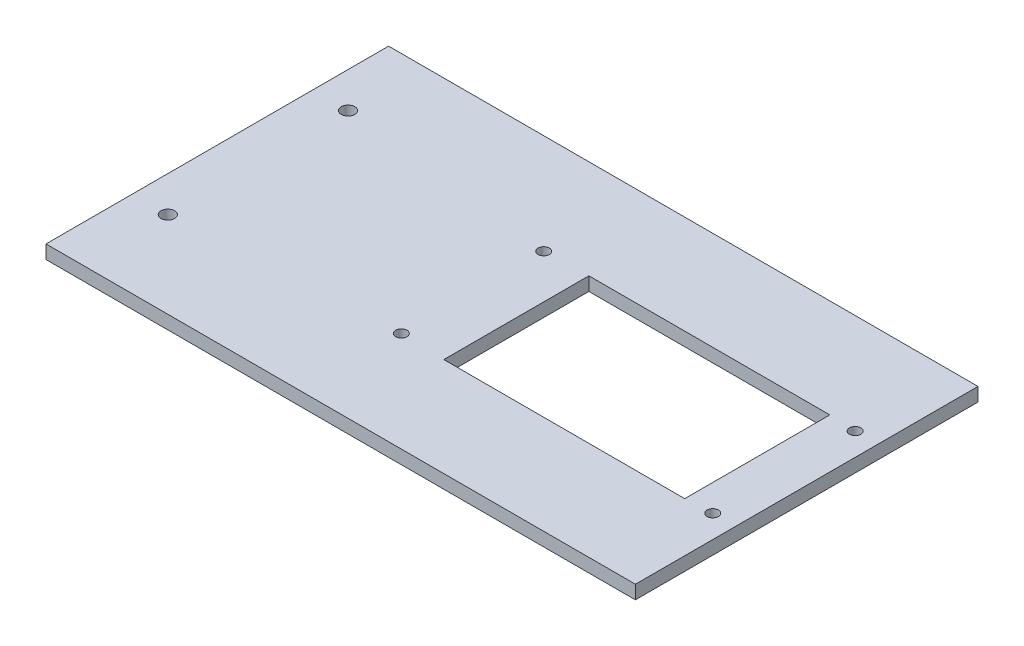
ISO-10303-21;
HEADER;
FILE_DESCRIPTION(('STEP AP214'),'2;1');
FILE_NAME('part.step','',(''),(''),'','','');
FILE_SCHEMA(('AUTOMOTIVE_DESIGN { 1 0 10303 214 1 1 1 1 }'));
ENDSEC;
DATA;
#1=APPLICATION_CONTEXT('core data for automotive mechanical design processes');
#2=APPLICATION_PROTOCOL_DEFINITION('international standard','automotive_design',2000,#1);
#3=PRODUCT_CONTEXT('',#1,'mechanical');
#4=PRODUCT('Part','Part','',(#3));
#5=PRODUCT_RELATED_PRODUCT_CATEGORY('part','',(#4));
#6=PRODUCT_DEFINITION_FORMATION('','',#4);
#7=PRODUCT_DEFINITION_CONTEXT('part definition',#1,'design');
#8=PRODUCT_DEFINITION('design','',#6,#7);
#9=PRODUCT_DEFINITION_SHAPE('','',#8);
#10=(LENGTH_UNIT() NAMED_UNIT(*) SI_UNIT(.MILLI.,.METRE.));
#11=(NAMED_UNIT(*) PLANE_ANGLE_UNIT() SI_UNIT($,.RADIAN.));
#12=(NAMED_UNIT(*) SI_UNIT($,.STERADIAN.) SOLID_ANGLE_UNIT());
#13=UNCERTAINTY_MEASURE_WITH_UNIT(LENGTH_MEASURE(1.E-05),#10,'distance_accuracy_value','');
#14=(GEOMETRIC_REPRESENTATION_CONTEXT(3) GLOBAL_UNCERTAINTY_ASSIGNED_CONTEXT((#13)) GLOBAL_UNIT_ASSIGNED_CONTEXT((#10,
#11,#12)) REPRESENTATION_CONTEXT('',''));
#15=CARTESIAN_POINT('',(0.,0.,0.));
#16=DIRECTION('',(0.,0.,1.));
#17=DIRECTION('',(1.,0.,0.));
#18=AXIS2_PLACEMENT_3D('',#15,#16,#17);
#19=CARTESIAN_POINT('',(0.,3.,0.));
#20=DIRECTION('',(0.,-1.,0.));
#21=DIRECTION('',(0.,0.,-1.));
#22=AXIS2_PLACEMENT_3D('',#19,#20,#21);
#23=PLANE('',#22);
#24=CARTESIAN_POINT('',(7.86,3.,56.71));
#25=DIRECTION('',(0.,1.,0.));
#26=DIRECTION('',(0.,0.,1.));
#27=AXIS2_PLACEMENT_3D('',#24,#25,#26);
#28=CIRCLE('',#27,1.5);
#29=CARTESIAN_POINT('',(7.86,3.,58.21));
#30=VERTEX_POINT('',#29);
#31=EDGE_CURVE('E272',#30,#30,#28,.T.);
#32=ORIENTED_EDGE('',*,*,#31,.F.);
#33=EDGE_LOOP('',(#32));
#34=FACE_BOUND('',#33,.T.);
#35=CARTESIAN_POINT('',(7.86,3.,16.83));
#36=DIRECTION('',(0.,1.,0.));
#37=DIRECTION('',(0.,0.,1.));
#38=AXIS2_PLACEMENT_3D('',#35,#36,#37);
#39=CIRCLE('',#38,1.5);
#40=CARTESIAN_POINT('',(7.86,3.,18.33));
#41=VERTEX_POINT('',#40);
#42=EDGE_CURVE('E276',#41,#41,#39,.T.);
#43=ORIENTED_EDGE('',*,*,#42,.F.);
#44=EDGE_LOOP('',(#43));
#45=FACE_BOUND('',#44,.T.);
#46=CARTESIAN_POINT('',(125.37,3.,53.65));
#47=DIRECTION('',(0.,1.,0.));
#48=DIRECTION('',(0.,0.,1.));
#49=AXIS2_PLACEMENT_3D('',#46,#47,#48);
#50=CIRCLE('',#49,1.24999999999998);
#51=CARTESIAN_POINT('',(125.37,3.,54.9));
#52=VERTEX_POINT('',#51);
#53=EDGE_CURVE('E283',#52,#52,#50,.T.);
#54=ORIENTED_EDGE('',*,*,#53,.F.);
#55=EDGE_LOOP('',(#54));
#56=FACE_BOUND('',#55,.T.);
#57=CARTESIAN_POINT('',(125.37,3.,22.15));
#58=DIRECTION('',(0.,1.,0.));
#59=DIRECTION('',(0.,0.,1.));
#60=AXIS2_PLACEMENT_3D('',#57,#58,#59);
#61=CIRCLE('',#60,1.24999999999998);
#62=CARTESIAN_POINT('',(125.37,3.,23.4));
#63=VERTEX_POINT('',#62);
#64=EDGE_CURVE('E300',#63,#63,#61,.T.);
#65=ORIENTED_EDGE('',*,*,#64,.F.);
#66=EDGE_LOOP('',(#65));
#67=FACE_BOUND('',#66,.T.);
#68=CARTESIAN_POINT('',(56.47,3.,22.15));
#69=DIRECTION('',(0.,1.,0.));
#70=DIRECTION('',(0.,0.,1.));
#71=AXIS2_PLACEMENT_3D('',#68,#69,#70);
#72=CIRCLE('',#71,1.25);
#73=CARTESIAN_POINT('',(56.47,3.,23.4));
#74=VERTEX_POINT('',#73);
#75=EDGE_CURVE('E292',#74,#74,#72,.T.);
#76=ORIENTED_EDGE('',*,*,#75,.F.);
#77=EDGE_LOOP('',(#76));
#78=FACE_BOUND('',#77,.T.);
#79=CARTESIAN_POINT('',(56.47,3.,53.65));
#80=DIRECTION('',(0.,1.,0.));
#81=DIRECTION('',(0.,0.,1.));
#82=AXIS2_PLACEMENT_3D('',#79,#80,#81);
#83=CIRCLE('',#82,1.25);
#84=CARTESIAN_POINT('',(56.47,3.,54.9));
#85=VERTEX_POINT('',#84);
#86=EDGE_CURVE('E138',#85,#85,#83,.T.);
#87=ORIENTED_EDGE('',*,*,#86,.F.);
#88=EDGE_LOOP('',(#87));
#89=FACE_BOUND('',#88,.T.);
#90=DIRECTION('',(1.,0.,0.));
#91=VECTOR('',#90,1.);
#92=CARTESIAN_POINT('',(0.,3.,0.));
#93=LINE('',#92,#91);
#94=CARTESIAN_POINT('',(0.,3.,0.));
#95=VERTEX_POINT('',#94);
#96=CARTESIAN_POINT('',(130.41,3.,0.));
#97=VERTEX_POINT('',#96);
#98=EDGE_CURVE('E155',#95,#97,#93,.T.);
#99=ORIENTED_EDGE('',*,*,#98,.F.);
#100=DIRECTION('',(0.,0.,1.));
#101=VECTOR('',#100,1.);
#102=CARTESIAN_POINT('',(0.,3.,0.));
#103=LINE('',#102,#101);
#104=CARTESIAN_POINT('',(0.,3.,75.8));
#105=VERTEX_POINT('',#104);
#106=EDGE_CURVE('E167',#95,#105,#103,.T.);
#107=ORIENTED_EDGE('',*,*,#106,.T.);
#108=DIRECTION('',(1.,0.,0.));
#109=VECTOR('',#108,1.);
#110=CARTESIAN_POINT('',(0.,3.,75.8));
#111=LINE('',#110,#109);
#112=CARTESIAN_POINT('',(130.41,3.,75.8));
#113=VERTEX_POINT('',#112);
#114=EDGE_CURVE('E164',#105,#113,#111,.T.);
#115=ORIENTED_EDGE('',*,*,#114,.T.);
#116=DIRECTION('',(0.,0.,1.));
#117=VECTOR('',#116,1.);
#118=CARTESIAN_POINT('',(130.41,3.,0.));
#119=LINE('',#118,#117);
#120=EDGE_CURVE('E159',#97,#113,#119,.T.);
#121=ORIENTED_EDGE('',*,*,#120,.F.);
#122=EDGE_LOOP('',(#99,#107,#115,#121));
#123=FACE_BOUND('',#122,.T.);
#124=DIRECTION('',(0.,0.,1.));
#125=VECTOR('',#124,1.);
#126=CARTESIAN_POINT('',(66.17,3.,21.85));
#127=LINE('',#126,#125);
#128=CARTESIAN_POINT('',(66.17,3.,21.85));
#129=VERTEX_POINT('',#128);
#130=CARTESIAN_POINT('',(66.17,3.,53.95));
#131=VERTEX_POINT('',#130);
#132=EDGE_CURVE('E106',#129,#131,#127,.T.);
#133=ORIENTED_EDGE('',*,*,#132,.F.);
#134=DIRECTION('',(1.,0.,0.));
#135=VECTOR('',#134,1.);
#136=CARTESIAN_POINT('',(66.17,3.,21.85));
#137=LINE('',#136,#135);
#138=CARTESIAN_POINT('',(119.47,3.,21.85));
#139=VERTEX_POINT('',#138);
#140=EDGE_CURVE('E130',#129,#139,#137,.T.);
#141=ORIENTED_EDGE('',*,*,#140,.T.);
#142=DIRECTION('',(0.,0.,1.));
#143=VECTOR('',#142,1.);
#144=CARTESIAN_POINT('',(119.47,3.,21.85));
#145=LINE('',#144,#143);
#146=CARTESIAN_POINT('',(119.47,3.,53.95));
#147=VERTEX_POINT('',#146);
#148=EDGE_CURVE('E57',#139,#147,#145,.T.);
#149=ORIENTED_EDGE('',*,*,#148,.T.);
#150=DIRECTION('',(1.,0.,0.));
#151=VECTOR('',#150,1.);
#152=CARTESIAN_POINT('',(66.17,3.,53.95));
#153=LINE('',#152,#151);
#154=EDGE_CURVE('E116',#131,#147,#153,.T.);
#155=ORIENTED_EDGE('',*,*,#154,.F.);
#156=EDGE_LOOP('',(#133,#141,#149,#155));
#157=FACE_BOUND('',#156,.T.);
#158=ADVANCED_FACE('F39',(#34,#45,#56,#67,#78,#89,#123,#157),#23,.F.);
#159=CARTESIAN_POINT('',(0.,0.,0.));
#160=DIRECTION('',(0.,-1.,0.));
#161=DIRECTION('',(0.,0.,-1.));
#162=AXIS2_PLACEMENT_3D('',#159,#160,#161);
#163=PLANE('',#162);
#164=CARTESIAN_POINT('',(7.86,0.,56.71));
#165=DIRECTION('',(0.,1.,0.));
#166=DIRECTION('',(0.,0.,1.));
#167=AXIS2_PLACEMENT_3D('',#164,#165,#166);
#168=CIRCLE('',#167,1.5);
#169=CARTESIAN_POINT('',(7.86,0.,58.21));
#170=VERTEX_POINT('',#169);
#171=EDGE_CURVE('E270',#170,#170,#168,.T.);
#172=ORIENTED_EDGE('',*,*,#171,.T.);
#173=EDGE_LOOP('',(#172));
#174=FACE_BOUND('',#173,.T.);
#175=CARTESIAN_POINT('',(7.86,0.,16.83));
#176=DIRECTION('',(0.,1.,0.));
#177=DIRECTION('',(0.,0.,1.));
#178=AXIS2_PLACEMENT_3D('',#175,#176,#177);
#179=CIRCLE('',#178,1.5);
#180=CARTESIAN_POINT('',(7.86,0.,18.33));
#181=VERTEX_POINT('',#180);
#182=EDGE_CURVE('E279',#181,#181,#179,.T.);
#183=ORIENTED_EDGE('',*,*,#182,.T.);
#184=EDGE_LOOP('',(#183));
#185=FACE_BOUND('',#184,.T.);
#186=CARTESIAN_POINT('',(125.37,0.,53.65));
#187=DIRECTION('',(0.,1.,0.));
#188=DIRECTION('',(0.,0.,1.));
#189=AXIS2_PLACEMENT_3D('',#186,#187,#188);
#190=CIRCLE('',#189,1.24999999999998);
#191=CARTESIAN_POINT('',(125.37,0.,54.9));
#192=VERTEX_POINT('',#191);
#193=EDGE_CURVE('E304',#192,#192,#190,.T.);
#194=ORIENTED_EDGE('',*,*,#193,.T.);
#195=EDGE_LOOP('',(#194));
#196=FACE_BOUND('',#195,.T.);
#197=CARTESIAN_POINT('',(125.37,0.,22.15));
#198=DIRECTION('',(0.,1.,0.));
#199=DIRECTION('',(0.,0.,1.));
#200=AXIS2_PLACEMENT_3D('',#197,#198,#199);
#201=CIRCLE('',#200,1.24999999999998);
#202=CARTESIAN_POINT('',(125.37,0.,23.4));
#203=VERTEX_POINT('',#202);
#204=EDGE_CURVE('E296',#203,#203,#201,.T.);
#205=ORIENTED_EDGE('',*,*,#204,.T.);
#206=EDGE_LOOP('',(#205));
#207=FACE_BOUND('',#206,.T.);
#208=CARTESIAN_POINT('',(56.47,0.,22.15));
#209=DIRECTION('',(0.,1.,0.));
#210=DIRECTION('',(0.,0.,1.));
#211=AXIS2_PLACEMENT_3D('',#208,#209,#210);
#212=CIRCLE('',#211,1.25);
#213=CARTESIAN_POINT('',(56.47,0.,23.4));
#214=VERTEX_POINT('',#213);
#215=EDGE_CURVE('E287',#214,#214,#212,.T.);
#216=ORIENTED_EDGE('',*,*,#215,.T.);
#217=EDGE_LOOP('',(#216));
#218=FACE_BOUND('',#217,.T.);
#219=CARTESIAN_POINT('',(56.47,0.,53.65));
#220=DIRECTION('',(0.,1.,0.));
#221=DIRECTION('',(0.,0.,1.));
#222=AXIS2_PLACEMENT_3D('',#219,#220,#221);
#223=CIRCLE('',#222,1.25);
#224=CARTESIAN_POINT('',(56.47,0.,54.9));
#225=VERTEX_POINT('',#224);
#226=EDGE_CURVE('E291',#225,#225,#223,.T.);
#227=ORIENTED_EDGE('',*,*,#226,.T.);
#228=EDGE_LOOP('',(#227));
#229=FACE_BOUND('',#228,.T.);
#230=DIRECTION('',(1.,0.,0.));
#231=VECTOR('',#230,1.);
#232=CARTESIAN_POINT('',(0.,0.,0.));
#233=LINE('',#232,#231);
#234=CARTESIAN_POINT('',(0.,0.,0.));
#235=VERTEX_POINT('',#234);
#236=CARTESIAN_POINT('',(130.41,0.,0.));
#237=VERTEX_POINT('',#236);
#238=EDGE_CURVE('E124',#235,#237,#233,.T.);
#239=ORIENTED_EDGE('',*,*,#238,.T.);
#240=DIRECTION('',(0.,0.,1.));
#241=VECTOR('',#240,1.);
#242=CARTESIAN_POINT('',(130.41,0.,0.));
#243=LINE('',#242,#241);
#244=CARTESIAN_POINT('',(130.41,0.,75.8));
#245=VERTEX_POINT('',#244);
#246=EDGE_CURVE('E173',#237,#245,#243,.T.);
#247=ORIENTED_EDGE('',*,*,#246,.T.);
#248=DIRECTION('',(1.,0.,0.));
#249=VECTOR('',#248,1.);
#250=CARTESIAN_POINT('',(0.,0.,75.8));
#251=LINE('',#250,#249);
#252=CARTESIAN_POINT('',(0.,0.,75.8));
#253=VERTEX_POINT('',#252);
#254=EDGE_CURVE('E177',#253,#245,#251,.T.);
#255=ORIENTED_EDGE('',*,*,#254,.F.);
#256=DIRECTION('',(0.,0.,1.));
#257=VECTOR('',#256,1.);
#258=CARTESIAN_POINT('',(0.,0.,0.));
#259=LINE('',#258,#257);
#260=EDGE_CURVE('E160',#235,#253,#259,.T.);
#261=ORIENTED_EDGE('',*,*,#260,.F.);
#262=EDGE_LOOP('',(#239,#247,#255,#261));
#263=FACE_BOUND('',#262,.T.);
#264=DIRECTION('',(1.,0.,0.));
#265=VECTOR('',#264,1.);
#266=CARTESIAN_POINT('',(66.17,0.,21.85));
#267=LINE('',#266,#265);
#268=CARTESIAN_POINT('',(66.17,0.,21.85));
#269=VERTEX_POINT('',#268);
#270=CARTESIAN_POINT('',(119.47,0.,21.85));
#271=VERTEX_POINT('',#270);
#272=EDGE_CURVE('E117',#269,#271,#267,.T.);
#273=ORIENTED_EDGE('',*,*,#272,.F.);
#274=DIRECTION('',(0.,0.,1.));
#275=VECTOR('',#274,1.);
#276=CARTESIAN_POINT('',(66.17,0.,21.85));
#277=LINE('',#276,#275);
#278=CARTESIAN_POINT('',(66.17,0.,53.95));
#279=VERTEX_POINT('',#278);
#280=EDGE_CURVE('E65',#269,#279,#277,.T.);
#281=ORIENTED_EDGE('',*,*,#280,.T.);
#282=DIRECTION('',(1.,0.,0.));
#283=VECTOR('',#282,1.);
#284=CARTESIAN_POINT('',(66.17,0.,53.95));
#285=LINE('',#284,#283);
#286=CARTESIAN_POINT('',(119.47,0.,53.95));
#287=VERTEX_POINT('',#286);
#288=EDGE_CURVE('E122',#279,#287,#285,.T.);
#289=ORIENTED_EDGE('',*,*,#288,.T.);
#290=DIRECTION('',(0.,0.,1.));
#291=VECTOR('',#290,1.);
#292=CARTESIAN_POINT('',(119.47,0.,21.85));
#293=LINE('',#292,#291);
#294=EDGE_CURVE('E141',#271,#287,#293,.T.);
#295=ORIENTED_EDGE('',*,*,#294,.F.);
#296=EDGE_LOOP('',(#273,#281,#289,#295));
#297=FACE_BOUND('',#296,.T.);
#298=ADVANCED_FACE('F199',(#174,#185,#196,#207,#218,#229,#263,#297),#163,.T.);
#299=CARTESIAN_POINT('',(0.,3.,0.));
#300=DIRECTION('',(0.,0.,-1.));
#301=DIRECTION('',(-1.,0.,0.));
#302=AXIS2_PLACEMENT_3D('',#299,#300,#301);
#303=PLANE('',#302);
#304=ORIENTED_EDGE('',*,*,#238,.F.);
#305=DIRECTION('',(0.,-1.,0.));
#306=VECTOR('',#305,1.);
#307=CARTESIAN_POINT('',(0.,3.,0.));
#308=LINE('',#307,#306);
#309=EDGE_CURVE('E11',#95,#235,#308,.T.);
#310=ORIENTED_EDGE('',*,*,#309,.F.);
#311=ORIENTED_EDGE('',*,*,#98,.T.);
#312=DIRECTION('',(0.,-1.,0.));
#313=VECTOR('',#312,1.);
#314=CARTESIAN_POINT('',(130.41,3.,0.));
#315=LINE('',#314,#313);
#316=EDGE_CURVE('E43',#97,#237,#315,.T.);
#317=ORIENTED_EDGE('',*,*,#316,.T.);
#318=EDGE_LOOP('',(#304,#310,#311,#317));
#319=FACE_BOUND('',#318,.T.);
#320=ADVANCED_FACE('F41',(#319),#303,.T.);
#321=CARTESIAN_POINT('',(0.,3.,0.));
#322=DIRECTION('',(1.,0.,0.));
#323=DIRECTION('',(0.,0.,-1.));
#324=AXIS2_PLACEMENT_3D('',#321,#322,#323);
#325=PLANE('',#324);
#326=ORIENTED_EDGE('',*,*,#260,.T.);
#327=DIRECTION('',(0.,-1.,0.));
#328=VECTOR('',#327,1.);
#329=CARTESIAN_POINT('',(0.,3.,75.8));
#330=LINE('',#329,#328);
#331=EDGE_CURVE('E49',#105,#253,#330,.T.);
#332=ORIENTED_EDGE('',*,*,#331,.F.);
#333=ORIENTED_EDGE('',*,*,#106,.F.);
#334=ORIENTED_EDGE('',*,*,#309,.T.);
#335=EDGE_LOOP('',(#326,#332,#333,#334));
#336=FACE_BOUND('',#335,.T.);
#337=ADVANCED_FACE('F203',(#336),#325,.F.);
#338=CARTESIAN_POINT('',(0.,3.,75.8));
#339=DIRECTION('',(0.,0.,-1.));
#340=DIRECTION('',(-1.,0.,0.));
#341=AXIS2_PLACEMENT_3D('',#338,#339,#340);
#342=PLANE('',#341);
#343=ORIENTED_EDGE('',*,*,#254,.T.);
#344=DIRECTION('',(0.,-1.,0.));
#345=VECTOR('',#344,1.);
#346=CARTESIAN_POINT('',(130.41,3.,75.8));
#347=LINE('',#346,#345);
#348=EDGE_CURVE('E185',#113,#245,#347,.T.);
#349=ORIENTED_EDGE('',*,*,#348,.F.);
#350=ORIENTED_EDGE('',*,*,#114,.F.);
#351=ORIENTED_EDGE('',*,*,#331,.T.);
#352=EDGE_LOOP('',(#343,#349,#350,#351));
#353=FACE_BOUND('',#352,.T.);
#354=ADVANCED_FACE('F207',(#353),#342,.F.);
#355=CARTESIAN_POINT('',(130.41,3.,0.));
#356=DIRECTION('',(1.,0.,0.));
#357=DIRECTION('',(0.,0.,-1.));
#358=AXIS2_PLACEMENT_3D('',#355,#356,#357);
#359=PLANE('',#358);
#360=ORIENTED_EDGE('',*,*,#246,.F.);
#361=ORIENTED_EDGE('',*,*,#316,.F.);
#362=ORIENTED_EDGE('',*,*,#120,.T.);
#363=ORIENTED_EDGE('',*,*,#348,.T.);
#364=EDGE_LOOP('',(#360,#361,#362,#363));
#365=FACE_BOUND('',#364,.T.);
#366=ADVANCED_FACE('F195',(#365),#359,.T.);
#367=CARTESIAN_POINT('',(66.17,3.,21.85));
#368=DIRECTION('',(1.,0.,0.));
#369=DIRECTION('',(0.,0.,-1.));
#370=AXIS2_PLACEMENT_3D('',#367,#368,#369);
#371=PLANE('',#370);
#372=ORIENTED_EDGE('',*,*,#280,.F.);
#373=DIRECTION('',(0.,-1.,0.));
#374=VECTOR('',#373,1.);
#375=CARTESIAN_POINT('',(66.17,3.,21.85));
#376=LINE('',#375,#374);
#377=EDGE_CURVE('E110',#129,#269,#376,.T.);
#378=ORIENTED_EDGE('',*,*,#377,.F.);
#379=ORIENTED_EDGE('',*,*,#132,.T.);
#380=DIRECTION('',(0.,-1.,0.));
#381=VECTOR('',#380,1.);
#382=CARTESIAN_POINT('',(66.17,3.,53.95));
#383=LINE('',#382,#381);
#384=EDGE_CURVE('E109',#131,#279,#383,.T.);
#385=ORIENTED_EDGE('',*,*,#384,.T.);
#386=EDGE_LOOP('',(#372,#378,#379,#385));
#387=FACE_BOUND('',#386,.T.);
#388=ADVANCED_FACE('F108',(#387),#371,.T.);
#389=CARTESIAN_POINT('',(66.17,3.,53.95));
#390=DIRECTION('',(0.,0.,-1.));
#391=DIRECTION('',(-1.,0.,0.));
#392=AXIS2_PLACEMENT_3D('',#389,#390,#391);
#393=PLANE('',#392);
#394=ORIENTED_EDGE('',*,*,#288,.F.);
#395=ORIENTED_EDGE('',*,*,#384,.F.);
#396=ORIENTED_EDGE('',*,*,#154,.T.);
#397=DIRECTION('',(0.,-1.,0.));
#398=VECTOR('',#397,1.);
#399=CARTESIAN_POINT('',(119.47,3.,53.95));
#400=LINE('',#399,#398);
#401=EDGE_CURVE('E125',#147,#287,#400,.T.);
#402=ORIENTED_EDGE('',*,*,#401,.T.);
#403=EDGE_LOOP('',(#394,#395,#396,#402));
#404=FACE_BOUND('',#403,.T.);
#405=ADVANCED_FACE('F120',(#404),#393,.T.);
#406=CARTESIAN_POINT('',(119.47,3.,21.85));
#407=DIRECTION('',(1.,0.,0.));
#408=DIRECTION('',(0.,0.,-1.));
#409=AXIS2_PLACEMENT_3D('',#406,#407,#408);
#410=PLANE('',#409);
#411=ORIENTED_EDGE('',*,*,#294,.T.);
#412=ORIENTED_EDGE('',*,*,#401,.F.);
#413=ORIENTED_EDGE('',*,*,#148,.F.);
#414=DIRECTION('',(0.,-1.,0.));
#415=VECTOR('',#414,1.);
#416=CARTESIAN_POINT('',(119.47,3.,21.85));
#417=LINE('',#416,#415);
#418=EDGE_CURVE('E150',#139,#271,#417,.T.);
#419=ORIENTED_EDGE('',*,*,#418,.T.);
#420=EDGE_LOOP('',(#411,#412,#413,#419));
#421=FACE_BOUND('',#420,.T.);
#422=ADVANCED_FACE('F232',(#421),#410,.F.);
#423=CARTESIAN_POINT('',(66.17,3.,21.85));
#424=DIRECTION('',(0.,0.,-1.));
#425=DIRECTION('',(-1.,0.,0.));
#426=AXIS2_PLACEMENT_3D('',#423,#424,#425);
#427=PLANE('',#426);
#428=ORIENTED_EDGE('',*,*,#272,.T.);
#429=ORIENTED_EDGE('',*,*,#418,.F.);
#430=ORIENTED_EDGE('',*,*,#140,.F.);
#431=ORIENTED_EDGE('',*,*,#377,.T.);
#432=EDGE_LOOP('',(#428,#429,#430,#431));
#433=FACE_BOUND('',#432,.T.);
#434=ADVANCED_FACE('F236',(#433),#427,.F.);
#435=CARTESIAN_POINT('',(56.47,3.,53.65));
#436=DIRECTION('',(0.,-1.,0.));
#437=DIRECTION('',(0.,0.,-1.));
#438=AXIS2_PLACEMENT_3D('',#435,#436,#437);
#439=CYLINDRICAL_SURFACE('',#438,1.25);
#440=ORIENTED_EDGE('',*,*,#86,.T.);
#441=EDGE_LOOP('',(#440));
#442=FACE_BOUND('',#441,.T.);
#443=ORIENTED_EDGE('',*,*,#226,.F.);
#444=EDGE_LOOP('',(#443));
#445=FACE_BOUND('',#444,.T.);
#446=ADVANCED_FACE('F241',(#442,#445),#439,.F.);
#447=CARTESIAN_POINT('',(56.47,3.,22.15));
#448=DIRECTION('',(0.,-1.,0.));
#449=DIRECTION('',(0.,0.,-1.));
#450=AXIS2_PLACEMENT_3D('',#447,#448,#449);
#451=CYLINDRICAL_SURFACE('',#450,1.25);
#452=ORIENTED_EDGE('',*,*,#75,.T.);
#453=EDGE_LOOP('',(#452));
#454=FACE_BOUND('',#453,.T.);
#455=ORIENTED_EDGE('',*,*,#215,.F.);
#456=EDGE_LOOP('',(#455));
#457=FACE_BOUND('',#456,.T.);
#458=ADVANCED_FACE('F245',(#454,#457),#451,.F.);
#459=CARTESIAN_POINT('',(125.37,3.,22.15));
#460=DIRECTION('',(0.,-1.,0.));
#461=DIRECTION('',(0.,0.,-1.));
#462=AXIS2_PLACEMENT_3D('',#459,#460,#461);
#463=CYLINDRICAL_SURFACE('',#462,1.24999999999998);
#464=ORIENTED_EDGE('',*,*,#64,.T.);
#465=EDGE_LOOP('',(#464));
#466=FACE_BOUND('',#465,.T.);
#467=ORIENTED_EDGE('',*,*,#204,.F.);
#468=EDGE_LOOP('',(#467));
#469=FACE_BOUND('',#468,.T.);
#470=ADVANCED_FACE('F251',(#466,#469),#463,.F.);
#471=CARTESIAN_POINT('',(125.37,3.,53.65));
#472=DIRECTION('',(0.,-1.,0.));
#473=DIRECTION('',(0.,0.,-1.));
#474=AXIS2_PLACEMENT_3D('',#471,#472,#473);
#475=CYLINDRICAL_SURFACE('',#474,1.24999999999998);
#476=ORIENTED_EDGE('',*,*,#53,.T.);
#477=EDGE_LOOP('',(#476));
#478=FACE_BOUND('',#477,.T.);
#479=ORIENTED_EDGE('',*,*,#193,.F.);
#480=EDGE_LOOP('',(#479));
#481=FACE_BOUND('',#480,.T.);
#482=ADVANCED_FACE('F247',(#478,#481),#475,.F.);
#483=CARTESIAN_POINT('',(7.86,0.,16.83));
#484=DIRECTION('',(0.,1.,0.));
#485=DIRECTION('',(0.,0.,1.));
#486=AXIS2_PLACEMENT_3D('',#483,#484,#485);
#487=CYLINDRICAL_SURFACE('',#486,1.5);
#488=ORIENTED_EDGE('',*,*,#182,.F.);
#489=EDGE_LOOP('',(#488));
#490=FACE_BOUND('',#489,.T.);
#491=ORIENTED_EDGE('',*,*,#42,.T.);
#492=EDGE_LOOP('',(#491));
#493=FACE_BOUND('',#492,.T.);
#494=ADVANCED_FACE('F250',(#490,#493),#487,.F.);
#495=CARTESIAN_POINT('',(7.86,0.,56.71));
#496=DIRECTION('',(0.,1.,0.));
#497=DIRECTION('',(0.,0.,1.));
#498=AXIS2_PLACEMENT_3D('',#495,#496,#497);
#499=CYLINDRICAL_SURFACE('',#498,1.5);
#500=ORIENTED_EDGE('',*,*,#171,.F.);
#501=EDGE_LOOP('',(#500));
#502=FACE_BOUND('',#501,.T.);
#503=ORIENTED_EDGE('',*,*,#31,.T.);
#504=EDGE_LOOP('',(#503));
#505=FACE_BOUND('',#504,.T.);
#506=ADVANCED_FACE('F261',(#502,#505),#499,.F.);
#507=CLOSED_SHELL('',(#158,#298,#320,#337,#354,#366,#388,#405,#422,#434,#446,#458,#470,#482,
#494,#506));
#508=MANIFOLD_SOLID_BREP('B2',#507);
#509=ADVANCED_BREP_SHAPE_REPRESENTATION('',(#18,#508),#14);
#510=SHAPE_DEFINITION_REPRESENTATION(#9,#509);
ENDSEC;
END-ISO-10303-21;
